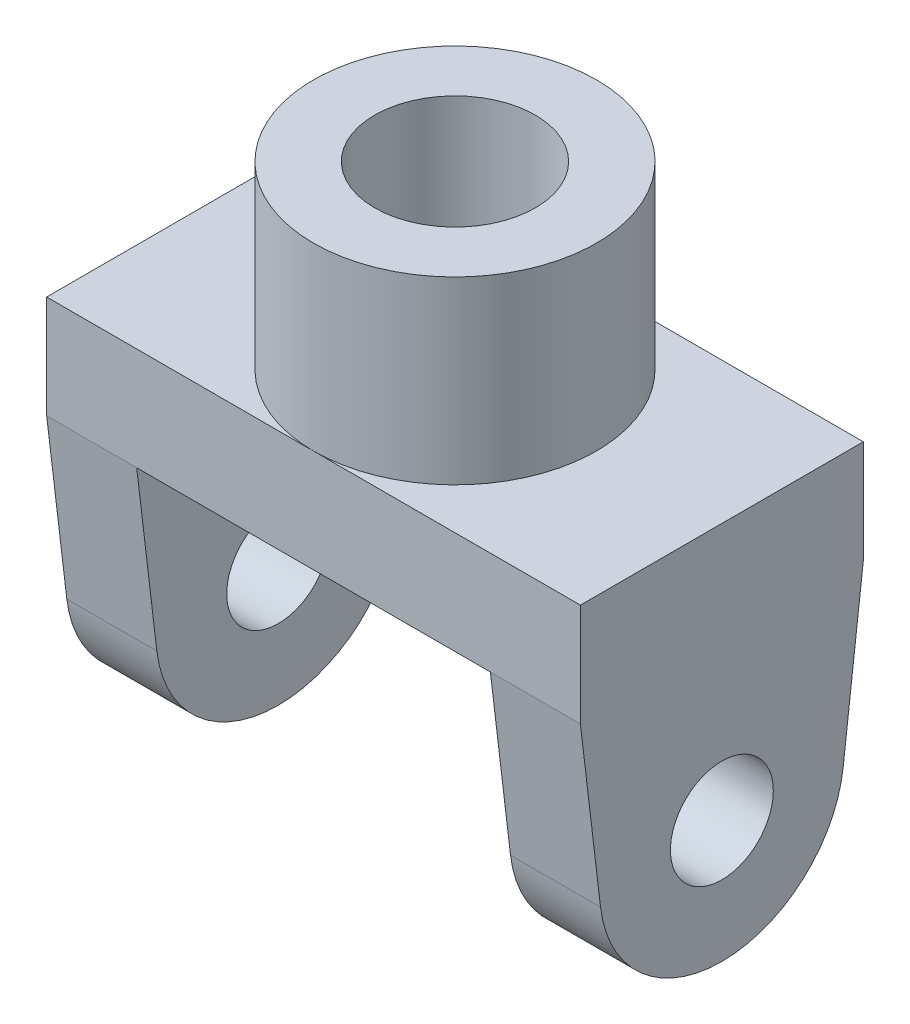
ISO-10303-21;
HEADER;
FILE_DESCRIPTION(('STEP AP214'),'2;1');
FILE_NAME('part.step','',(''),(''),'','','');
FILE_SCHEMA(('AUTOMOTIVE_DESIGN { 1 0 10303 214 1 1 1 1 }'));
ENDSEC;
DATA;
#1=APPLICATION_CONTEXT('core data for automotive mechanical design processes');
#2=APPLICATION_PROTOCOL_DEFINITION('international standard','automotive_design',2000,#1);
#3=PRODUCT_CONTEXT('',#1,'mechanical');
#4=PRODUCT('Part','Part','',(#3));
#5=PRODUCT_RELATED_PRODUCT_CATEGORY('part','',(#4));
#6=PRODUCT_DEFINITION_FORMATION('','',#4);
#7=PRODUCT_DEFINITION_CONTEXT('part definition',#1,'design');
#8=PRODUCT_DEFINITION('design','',#6,#7);
#9=PRODUCT_DEFINITION_SHAPE('','',#8);
#10=(LENGTH_UNIT() NAMED_UNIT(*) SI_UNIT(.MILLI.,.METRE.));
#11=(NAMED_UNIT(*) PLANE_ANGLE_UNIT() SI_UNIT($,.RADIAN.));
#12=(NAMED_UNIT(*) SI_UNIT($,.STERADIAN.) SOLID_ANGLE_UNIT());
#13=UNCERTAINTY_MEASURE_WITH_UNIT(LENGTH_MEASURE(1.E-05),#10,'distance_accuracy_value','');
#14=(GEOMETRIC_REPRESENTATION_CONTEXT(3) GLOBAL_UNCERTAINTY_ASSIGNED_CONTEXT((#13)) GLOBAL_UNIT_ASSIGNED_CONTEXT((#10,
#11,#12)) REPRESENTATION_CONTEXT('',''));
#15=CARTESIAN_POINT('',(0.,0.,0.));
#16=DIRECTION('',(0.,0.,1.));
#17=DIRECTION('',(1.,0.,0.));
#18=AXIS2_PLACEMENT_3D('',#15,#16,#17);
#19=CARTESIAN_POINT('',(0.,0.,0.));
#20=DIRECTION('',(0.,1.,0.));
#21=DIRECTION('',(0.,0.,1.));
#22=AXIS2_PLACEMENT_3D('',#19,#20,#21);
#23=PLANE('',#22);
#24=DIRECTION('',(0.,0.,-1.));
#25=VECTOR('',#24,1.);
#26=CARTESIAN_POINT('',(-55.,0.,0.));
#27=LINE('',#26,#25);
#28=CARTESIAN_POINT('',(-55.,0.,44.));
#29=VERTEX_POINT('',#28);
#30=CARTESIAN_POINT('',(-55.,0.,-44.));
#31=VERTEX_POINT('',#30);
#32=EDGE_CURVE('E125',#29,#31,#27,.T.);
#33=ORIENTED_EDGE('',*,*,#32,.T.);
#34=DIRECTION('',(-1.,0.,0.));
#35=VECTOR('',#34,1.);
#36=CARTESIAN_POINT('',(-83.,0.,-44.));
#37=LINE('',#36,#35);
#38=CARTESIAN_POINT('',(55.,0.,-44.));
#39=VERTEX_POINT('',#38);
#40=EDGE_CURVE('E144',#39,#31,#37,.T.);
#41=ORIENTED_EDGE('',*,*,#40,.F.);
#42=DIRECTION('',(0.,0.,-1.));
#43=VECTOR('',#42,1.);
#44=CARTESIAN_POINT('',(55.,0.,0.));
#45=LINE('',#44,#43);
#46=CARTESIAN_POINT('',(54.9999999999999,0.,44.));
#47=VERTEX_POINT('',#46);
#48=EDGE_CURVE('E205',#47,#39,#45,.T.);
#49=ORIENTED_EDGE('',*,*,#48,.F.);
#50=DIRECTION('',(1.,0.,0.));
#51=VECTOR('',#50,1.);
#52=CARTESIAN_POINT('',(-83.,0.,44.));
#53=LINE('',#52,#51);
#54=EDGE_CURVE('E61',#29,#47,#53,.T.);
#55=ORIENTED_EDGE('',*,*,#54,.F.);
#56=EDGE_LOOP('',(#33,#41,#49,#55));
#57=FACE_BOUND('',#56,.T.);
#58=ADVANCED_FACE('F36',(#57),#23,.F.);
#59=CARTESIAN_POINT('',(0.,32.,0.));
#60=DIRECTION('',(0.,1.,0.));
#61=DIRECTION('',(0.,0.,1.));
#62=AXIS2_PLACEMENT_3D('',#59,#60,#61);
#63=PLANE('',#62);
#64=CARTESIAN_POINT('',(0.,32.,0.));
#65=DIRECTION('',(0.,1.,0.));
#66=DIRECTION('',(0.,0.,1.));
#67=AXIS2_PLACEMENT_3D('',#64,#65,#66);
#68=CIRCLE('',#67,44.);
#69=CARTESIAN_POINT('',(0.,32.,44.));
#70=VERTEX_POINT('',#69);
#71=CARTESIAN_POINT('',(0.,32.,-44.));
#72=VERTEX_POINT('',#71);
#73=EDGE_CURVE('E46',#70,#72,#68,.T.);
#74=ORIENTED_EDGE('',*,*,#73,.F.);
#75=DIRECTION('',(1.,0.,0.));
#76=VECTOR('',#75,1.);
#77=CARTESIAN_POINT('',(-83.,32.,44.));
#78=LINE('',#77,#76);
#79=CARTESIAN_POINT('',(83.,32.,44.));
#80=VERTEX_POINT('',#79);
#81=EDGE_CURVE('E215',#70,#80,#78,.T.);
#82=ORIENTED_EDGE('',*,*,#81,.T.);
#83=DIRECTION('',(0.,0.,-1.));
#84=VECTOR('',#83,1.);
#85=CARTESIAN_POINT('',(83.,32.,-44.));
#86=LINE('',#85,#84);
#87=CARTESIAN_POINT('',(83.,32.,-44.));
#88=VERTEX_POINT('',#87);
#89=EDGE_CURVE('E160',#80,#88,#86,.T.);
#90=ORIENTED_EDGE('',*,*,#89,.T.);
#91=DIRECTION('',(-1.,0.,0.));
#92=VECTOR('',#91,1.);
#93=CARTESIAN_POINT('',(-83.,32.,-44.));
#94=LINE('',#93,#92);
#95=EDGE_CURVE('E172',#88,#72,#94,.T.);
#96=ORIENTED_EDGE('',*,*,#95,.T.);
#97=EDGE_LOOP('',(#74,#82,#90,#96));
#98=FACE_BOUND('',#97,.T.);
#99=ADVANCED_FACE('F225',(#98),#63,.T.);
#100=CARTESIAN_POINT('',(83.,32.,-44.));
#101=DIRECTION('',(-1.,0.,0.));
#102=DIRECTION('',(0.,0.,1.));
#103=AXIS2_PLACEMENT_3D('',#100,#101,#102);
#104=PLANE('',#103);
#105=DIRECTION('',(0.,-1.,0.));
#106=VECTOR('',#105,1.);
#107=CARTESIAN_POINT('',(83.,32.,44.));
#108=LINE('',#107,#106);
#109=CARTESIAN_POINT('',(83.,0.,44.));
#110=VERTEX_POINT('',#109);
#111=EDGE_CURVE('E161',#80,#110,#108,.T.);
#112=ORIENTED_EDGE('',*,*,#111,.T.);
#113=DIRECTION('',(0.,0.992949618101236,0.118537149926132));
#114=VECTOR('',#113,1.);
#115=CARTESIAN_POINT('',(83.,-5.17886238099833,43.3817535398451));
#116=LINE('',#115,#114);
#117=CARTESIAN_POINT('',(83.,-52.5044116971931,37.7320854878469));
#118=VERTEX_POINT('',#117);
#119=EDGE_CURVE('E194',#118,#110,#116,.T.);
#120=ORIENTED_EDGE('',*,*,#119,.F.);
#121=CARTESIAN_POINT('',(83.,-48.,0.));
#122=DIRECTION('',(1.,0.,0.));
#123=DIRECTION('',(0.,0.,-1.));
#124=AXIS2_PLACEMENT_3D('',#121,#122,#123);
#125=CIRCLE('',#124,38.);
#126=CARTESIAN_POINT('',(83.,-52.5044116971931,-37.732085487847));
#127=VERTEX_POINT('',#126);
#128=EDGE_CURVE('E188',#118,#127,#125,.T.);
#129=ORIENTED_EDGE('',*,*,#128,.T.);
#130=DIRECTION('',(0.,0.992949618101236,-0.118537149926133));
#131=VECTOR('',#130,1.);
#132=CARTESIAN_POINT('',(83.,-5.17886238099835,-43.3817535398452));
#133=LINE('',#132,#131);
#134=CARTESIAN_POINT('',(83.,0.,-44.));
#135=VERTEX_POINT('',#134);
#136=EDGE_CURVE('E181',#127,#135,#133,.T.);
#137=ORIENTED_EDGE('',*,*,#136,.T.);
#138=DIRECTION('',(0.,-1.,0.));
#139=VECTOR('',#138,1.);
#140=CARTESIAN_POINT('',(83.,32.,-44.));
#141=LINE('',#140,#139);
#142=EDGE_CURVE('E40',#88,#135,#141,.T.);
#143=ORIENTED_EDGE('',*,*,#142,.F.);
#144=ORIENTED_EDGE('',*,*,#89,.F.);
#145=EDGE_LOOP('',(#112,#120,#129,#137,#143,#144));
#146=FACE_BOUND('',#145,.T.);
#147=CARTESIAN_POINT('',(83.,-48.,0.));
#148=DIRECTION('',(1.,0.,0.));
#149=DIRECTION('',(0.,0.,-1.));
#150=AXIS2_PLACEMENT_3D('',#147,#148,#149);
#151=CIRCLE('',#150,16.);
#152=CARTESIAN_POINT('',(83.,-48.,-16.));
#153=VERTEX_POINT('',#152);
#154=EDGE_CURVE('E440',#153,#153,#151,.T.);
#155=ORIENTED_EDGE('',*,*,#154,.F.);
#156=EDGE_LOOP('',(#155));
#157=FACE_BOUND('',#156,.T.);
#158=ADVANCED_FACE('F38',(#146,#157),#104,.F.);
#159=CARTESIAN_POINT('',(-83.,32.,-44.));
#160=DIRECTION('',(0.,0.,1.));
#161=DIRECTION('',(1.,0.,0.));
#162=AXIS2_PLACEMENT_3D('',#159,#160,#161);
#163=PLANE('',#162);
#164=EDGE_CURVE('E149',#135,#39,#37,.T.);
#165=ORIENTED_EDGE('',*,*,#164,.T.);
#166=ORIENTED_EDGE('',*,*,#40,.T.);
#167=DIRECTION('',(-1.,0.,0.));
#168=VECTOR('',#167,1.);
#169=CARTESIAN_POINT('',(-55.,0.,-44.));
#170=LINE('',#169,#168);
#171=CARTESIAN_POINT('',(-83.,0.,-44.));
#172=VERTEX_POINT('',#171);
#173=EDGE_CURVE('E133',#31,#172,#170,.T.);
#174=ORIENTED_EDGE('',*,*,#173,.T.);
#175=DIRECTION('',(0.,-1.,0.));
#176=VECTOR('',#175,1.);
#177=CARTESIAN_POINT('',(-83.,32.,-44.));
#178=LINE('',#177,#176);
#179=CARTESIAN_POINT('',(-83.,32.,-44.));
#180=VERTEX_POINT('',#179);
#181=EDGE_CURVE('E166',#180,#172,#178,.T.);
#182=ORIENTED_EDGE('',*,*,#181,.F.);
#183=EDGE_CURVE('E213',#72,#180,#94,.T.);
#184=ORIENTED_EDGE('',*,*,#183,.F.);
#185=ORIENTED_EDGE('',*,*,#95,.F.);
#186=ORIENTED_EDGE('',*,*,#142,.T.);
#187=EDGE_LOOP('',(#165,#166,#174,#182,#184,#185,#186));
#188=FACE_BOUND('',#187,.T.);
#189=ADVANCED_FACE('F147',(#188),#163,.F.);
#190=CARTESIAN_POINT('',(-83.,32.,-44.));
#191=DIRECTION('',(1.,0.,0.));
#192=DIRECTION('',(0.,0.,-1.));
#193=AXIS2_PLACEMENT_3D('',#190,#191,#192);
#194=PLANE('',#193);
#195=ORIENTED_EDGE('',*,*,#181,.T.);
#196=DIRECTION('',(0.,0.992949618101236,-0.118537149926133));
#197=VECTOR('',#196,1.);
#198=CARTESIAN_POINT('',(-83.,-5.17886238099835,-43.3817535398452));
#199=LINE('',#198,#197);
#200=CARTESIAN_POINT('',(-83.,-52.5044116971931,-37.732085487847));
#201=VERTEX_POINT('',#200);
#202=EDGE_CURVE('E135',#201,#172,#199,.T.);
#203=ORIENTED_EDGE('',*,*,#202,.F.);
#204=CARTESIAN_POINT('',(-83.,-48.,0.));
#205=DIRECTION('',(1.,0.,0.));
#206=DIRECTION('',(0.,0.,-1.));
#207=AXIS2_PLACEMENT_3D('',#204,#205,#206);
#208=CIRCLE('',#207,38.);
#209=CARTESIAN_POINT('',(-83.,-52.5044116971931,37.7320854878469));
#210=VERTEX_POINT('',#209);
#211=EDGE_CURVE('E424',#210,#201,#208,.T.);
#212=ORIENTED_EDGE('',*,*,#211,.F.);
#213=DIRECTION('',(0.,0.992949618101236,0.118537149926132));
#214=VECTOR('',#213,1.);
#215=CARTESIAN_POINT('',(-83.,-5.17886238099833,43.3817535398451));
#216=LINE('',#215,#214);
#217=CARTESIAN_POINT('',(-83.,0.,44.));
#218=VERTEX_POINT('',#217);
#219=EDGE_CURVE('E434',#210,#218,#216,.T.);
#220=ORIENTED_EDGE('',*,*,#219,.T.);
#221=DIRECTION('',(0.,-1.,0.));
#222=VECTOR('',#221,1.);
#223=CARTESIAN_POINT('',(-83.,32.,44.));
#224=LINE('',#223,#222);
#225=CARTESIAN_POINT('',(-83.,32.,44.));
#226=VERTEX_POINT('',#225);
#227=EDGE_CURVE('E164',#226,#218,#224,.T.);
#228=ORIENTED_EDGE('',*,*,#227,.F.);
#229=DIRECTION('',(0.,0.,1.));
#230=VECTOR('',#229,1.);
#231=CARTESIAN_POINT('',(-83.,32.,-44.));
#232=LINE('',#231,#230);
#233=EDGE_CURVE('E214',#180,#226,#232,.T.);
#234=ORIENTED_EDGE('',*,*,#233,.F.);
#235=EDGE_LOOP('',(#195,#203,#212,#220,#228,#234));
#236=FACE_BOUND('',#235,.T.);
#237=CARTESIAN_POINT('',(-83.,-48.,0.));
#238=DIRECTION('',(1.,0.,0.));
#239=DIRECTION('',(0.,0.,-1.));
#240=AXIS2_PLACEMENT_3D('',#237,#238,#239);
#241=CIRCLE('',#240,16.);
#242=CARTESIAN_POINT('',(-83.,-48.,-16.));
#243=VERTEX_POINT('',#242);
#244=EDGE_CURVE('E431',#243,#243,#241,.T.);
#245=ORIENTED_EDGE('',*,*,#244,.T.);
#246=EDGE_LOOP('',(#245));
#247=FACE_BOUND('',#246,.T.);
#248=ADVANCED_FACE('F252',(#236,#247),#194,.F.);
#249=CARTESIAN_POINT('',(-83.,32.,44.));
#250=DIRECTION('',(0.,0.,-1.));
#251=DIRECTION('',(-1.,0.,0.));
#252=AXIS2_PLACEMENT_3D('',#249,#250,#251);
#253=PLANE('',#252);
#254=EDGE_CURVE('E158',#218,#29,#53,.T.);
#255=ORIENTED_EDGE('',*,*,#254,.T.);
#256=ORIENTED_EDGE('',*,*,#54,.T.);
#257=DIRECTION('',(1.,0.,0.));
#258=VECTOR('',#257,1.);
#259=CARTESIAN_POINT('',(55.,0.,44.));
#260=LINE('',#259,#258);
#261=EDGE_CURVE('E198',#47,#110,#260,.T.);
#262=ORIENTED_EDGE('',*,*,#261,.T.);
#263=ORIENTED_EDGE('',*,*,#111,.F.);
#264=ORIENTED_EDGE('',*,*,#81,.F.);
#265=EDGE_CURVE('E156',#226,#70,#78,.T.);
#266=ORIENTED_EDGE('',*,*,#265,.F.);
#267=ORIENTED_EDGE('',*,*,#227,.T.);
#268=EDGE_LOOP('',(#255,#256,#262,#263,#264,#266,#267));
#269=FACE_BOUND('',#268,.T.);
#270=ADVANCED_FACE('F224',(#269),#253,.F.);
#271=EDGE_CURVE('E11',#72,#70,#68,.T.);
#272=ORIENTED_EDGE('',*,*,#271,.F.);
#273=ORIENTED_EDGE('',*,*,#183,.T.);
#274=ORIENTED_EDGE('',*,*,#233,.T.);
#275=ORIENTED_EDGE('',*,*,#265,.T.);
#276=EDGE_LOOP('',(#272,#273,#274,#275));
#277=FACE_BOUND('',#276,.T.);
#278=ADVANCED_FACE('F223',(#277),#63,.T.);
#279=CARTESIAN_POINT('',(0.,88.,0.));
#280=DIRECTION('',(0.,1.,0.));
#281=DIRECTION('',(0.,0.,1.));
#282=AXIS2_PLACEMENT_3D('',#279,#280,#281);
#283=PLANE('',#282);
#284=CARTESIAN_POINT('',(0.,88.,0.));
#285=DIRECTION('',(0.,1.,0.));
#286=DIRECTION('',(0.,0.,1.));
#287=AXIS2_PLACEMENT_3D('',#284,#285,#286);
#288=CIRCLE('',#287,44.);
#289=CARTESIAN_POINT('',(0.,88.,44.));
#290=VERTEX_POINT('',#289);
#291=EDGE_CURVE('E150',#290,#290,#288,.T.);
#292=ORIENTED_EDGE('',*,*,#291,.T.);
#293=EDGE_LOOP('',(#292));
#294=FACE_BOUND('',#293,.T.);
#295=CARTESIAN_POINT('',(0.,88.,0.));
#296=DIRECTION('',(0.,1.,0.));
#297=DIRECTION('',(0.,0.,1.));
#298=AXIS2_PLACEMENT_3D('',#295,#296,#297);
#299=CIRCLE('',#298,25.);
#300=CARTESIAN_POINT('',(0.,88.,25.));
#301=VERTEX_POINT('',#300);
#302=EDGE_CURVE('E206',#301,#301,#299,.T.);
#303=ORIENTED_EDGE('',*,*,#302,.F.);
#304=EDGE_LOOP('',(#303));
#305=FACE_BOUND('',#304,.T.);
#306=ADVANCED_FACE('F230',(#294,#305),#283,.T.);
#307=CARTESIAN_POINT('',(0.,88.,0.));
#308=DIRECTION('',(0.,-1.,0.));
#309=DIRECTION('',(0.,0.,-1.));
#310=AXIS2_PLACEMENT_3D('',#307,#308,#309);
#311=CYLINDRICAL_SURFACE('',#310,44.);
#312=ORIENTED_EDGE('',*,*,#291,.F.);
#313=EDGE_LOOP('',(#312));
#314=FACE_BOUND('',#313,.T.);
#315=ORIENTED_EDGE('',*,*,#73,.T.);
#316=ORIENTED_EDGE('',*,*,#271,.T.);
#317=EDGE_LOOP('',(#315,#316));
#318=FACE_BOUND('',#317,.T.);
#319=ADVANCED_FACE('F227',(#314,#318),#311,.T.);
#320=CARTESIAN_POINT('',(0.,88.,0.));
#321=DIRECTION('',(0.,-1.,0.));
#322=DIRECTION('',(0.,0.,-1.));
#323=AXIS2_PLACEMENT_3D('',#320,#321,#322);
#324=CYLINDRICAL_SURFACE('',#323,25.);
#325=ORIENTED_EDGE('',*,*,#302,.T.);
#326=EDGE_LOOP('',(#325));
#327=FACE_BOUND('',#326,.T.);
#328=CARTESIAN_POINT('',(0.,32.,0.));
#329=DIRECTION('',(0.,1.,0.));
#330=DIRECTION('',(0.,0.,1.));
#331=AXIS2_PLACEMENT_3D('',#328,#329,#330);
#332=CIRCLE('',#331,25.);
#333=CARTESIAN_POINT('',(0.,32.,25.));
#334=VERTEX_POINT('',#333);
#335=EDGE_CURVE('E200',#334,#334,#332,.T.);
#336=ORIENTED_EDGE('',*,*,#335,.F.);
#337=EDGE_LOOP('',(#336));
#338=FACE_BOUND('',#337,.T.);
#339=ADVANCED_FACE('F229',(#327,#338),#324,.F.);
#340=ORIENTED_EDGE('',*,*,#335,.T.);
#341=EDGE_LOOP('',(#340));
#342=FACE_BOUND('',#341,.T.);
#343=ADVANCED_FACE('F237',(#342),#63,.T.);
#344=CARTESIAN_POINT('',(55.,-5.17886238099833,43.3817535398451));
#345=DIRECTION('',(0.,0.118537149926132,-0.992949618101236));
#346=DIRECTION('',(0.,0.992949618101236,0.118537149926132));
#347=AXIS2_PLACEMENT_3D('',#344,#345,#346);
#348=PLANE('',#347);
#349=ORIENTED_EDGE('',*,*,#119,.T.);
#350=ORIENTED_EDGE('',*,*,#261,.F.);
#351=DIRECTION('',(0.,0.992949618101236,0.118537149926132));
#352=VECTOR('',#351,1.);
#353=CARTESIAN_POINT('',(55.,-5.17886238099833,43.3817535398451));
#354=LINE('',#353,#352);
#355=CARTESIAN_POINT('',(55.,-52.5044116971931,37.7320854878469));
#356=VERTEX_POINT('',#355);
#357=EDGE_CURVE('E192',#356,#47,#354,.T.);
#358=ORIENTED_EDGE('',*,*,#357,.F.);
#359=DIRECTION('',(1.,0.,0.));
#360=VECTOR('',#359,1.);
#361=CARTESIAN_POINT('',(55.,-52.5044116971931,37.7320854878469));
#362=LINE('',#361,#360);
#363=EDGE_CURVE('E203',#356,#118,#362,.T.);
#364=ORIENTED_EDGE('',*,*,#363,.T.);
#365=EDGE_LOOP('',(#349,#350,#358,#364));
#366=FACE_BOUND('',#365,.T.);
#367=ADVANCED_FACE('F297',(#366),#348,.F.);
#368=CARTESIAN_POINT('',(55.,-5.17886238099835,-43.3817535398452));
#369=DIRECTION('',(0.,-0.118537149926133,-0.992949618101236));
#370=DIRECTION('',(0.,0.992949618101236,-0.118537149926133));
#371=AXIS2_PLACEMENT_3D('',#368,#369,#370);
#372=PLANE('',#371);
#373=ORIENTED_EDGE('',*,*,#136,.F.);
#374=DIRECTION('',(1.,0.,0.));
#375=VECTOR('',#374,1.);
#376=CARTESIAN_POINT('',(55.,-52.5044116971931,-37.732085487847));
#377=LINE('',#376,#375);
#378=CARTESIAN_POINT('',(55.,-52.5044116971931,-37.732085487847));
#379=VERTEX_POINT('',#378);
#380=EDGE_CURVE('E201',#379,#127,#377,.T.);
#381=ORIENTED_EDGE('',*,*,#380,.F.);
#382=DIRECTION('',(0.,0.992949618101236,-0.118537149926133));
#383=VECTOR('',#382,1.);
#384=CARTESIAN_POINT('',(55.,-5.17886238099835,-43.3817535398452));
#385=LINE('',#384,#383);
#386=EDGE_CURVE('E184',#379,#39,#385,.T.);
#387=ORIENTED_EDGE('',*,*,#386,.T.);
#388=ORIENTED_EDGE('',*,*,#164,.F.);
#389=EDGE_LOOP('',(#373,#381,#387,#388));
#390=FACE_BOUND('',#389,.T.);
#391=ADVANCED_FACE('F180',(#390),#372,.T.);
#392=CARTESIAN_POINT('',(55.,-48.,0.));
#393=DIRECTION('',(1.,0.,0.));
#394=DIRECTION('',(0.,0.,-1.));
#395=AXIS2_PLACEMENT_3D('',#392,#393,#394);
#396=CYLINDRICAL_SURFACE('',#395,16.);
#397=CARTESIAN_POINT('',(55.,-48.,0.));
#398=DIRECTION('',(1.,0.,0.));
#399=DIRECTION('',(0.,0.,-1.));
#400=AXIS2_PLACEMENT_3D('',#397,#398,#399);
#401=CIRCLE('',#400,16.);
#402=CARTESIAN_POINT('',(55.,-48.,-16.));
#403=VERTEX_POINT('',#402);
#404=EDGE_CURVE('E189',#403,#403,#401,.T.);
#405=ORIENTED_EDGE('',*,*,#404,.F.);
#406=EDGE_LOOP('',(#405));
#407=FACE_BOUND('',#406,.T.);
#408=ORIENTED_EDGE('',*,*,#154,.T.);
#409=EDGE_LOOP('',(#408));
#410=FACE_BOUND('',#409,.T.);
#411=ADVANCED_FACE('F312',(#407,#410),#396,.F.);
#412=CARTESIAN_POINT('',(55.,-48.,0.));
#413=DIRECTION('',(1.,0.,0.));
#414=DIRECTION('',(0.,0.,-1.));
#415=AXIS2_PLACEMENT_3D('',#412,#413,#414);
#416=CYLINDRICAL_SURFACE('',#415,38.);
#417=ORIENTED_EDGE('',*,*,#128,.F.);
#418=ORIENTED_EDGE('',*,*,#363,.F.);
#419=CARTESIAN_POINT('',(55.,-48.,0.));
#420=DIRECTION('',(1.,0.,0.));
#421=DIRECTION('',(0.,0.,-1.));
#422=AXIS2_PLACEMENT_3D('',#419,#420,#421);
#423=CIRCLE('',#422,38.);
#424=EDGE_CURVE('E444',#356,#379,#423,.T.);
#425=ORIENTED_EDGE('',*,*,#424,.T.);
#426=ORIENTED_EDGE('',*,*,#380,.T.);
#427=EDGE_LOOP('',(#417,#418,#425,#426));
#428=FACE_BOUND('',#427,.T.);
#429=ADVANCED_FACE('F319',(#428),#416,.T.);
#430=CARTESIAN_POINT('',(55.,0.,0.));
#431=DIRECTION('',(1.,0.,0.));
#432=DIRECTION('',(0.,0.,-1.));
#433=AXIS2_PLACEMENT_3D('',#430,#431,#432);
#434=PLANE('',#433);
#435=ORIENTED_EDGE('',*,*,#404,.T.);
#436=EDGE_LOOP('',(#435));
#437=FACE_BOUND('',#436,.T.);
#438=ORIENTED_EDGE('',*,*,#357,.T.);
#439=ORIENTED_EDGE('',*,*,#48,.T.);
#440=ORIENTED_EDGE('',*,*,#386,.F.);
#441=ORIENTED_EDGE('',*,*,#424,.F.);
#442=EDGE_LOOP('',(#438,#439,#440,#441));
#443=FACE_BOUND('',#442,.T.);
#444=ADVANCED_FACE('F327',(#437,#443),#434,.F.);
#445=CARTESIAN_POINT('',(-55.,-5.17886238099833,43.3817535398451));
#446=DIRECTION('',(0.,-0.118537149926132,0.992949618101236));
#447=DIRECTION('',(0.,-0.992949618101236,-0.118537149926132));
#448=AXIS2_PLACEMENT_3D('',#445,#446,#447);
#449=PLANE('',#448);
#450=ORIENTED_EDGE('',*,*,#219,.F.);
#451=DIRECTION('',(-1.,0.,0.));
#452=VECTOR('',#451,1.);
#453=CARTESIAN_POINT('',(-55.,-52.5044116971931,37.7320854878469));
#454=LINE('',#453,#452);
#455=CARTESIAN_POINT('',(-55.,-52.5044116971931,37.7320854878469));
#456=VERTEX_POINT('',#455);
#457=EDGE_CURVE('E438',#456,#210,#454,.T.);
#458=ORIENTED_EDGE('',*,*,#457,.F.);
#459=DIRECTION('',(0.,0.992949618101236,0.118537149926132));
#460=VECTOR('',#459,1.);
#461=CARTESIAN_POINT('',(-55.,-5.17886238099833,43.3817535398451));
#462=LINE('',#461,#460);
#463=EDGE_CURVE('E53',#456,#29,#462,.T.);
#464=ORIENTED_EDGE('',*,*,#463,.T.);
#465=ORIENTED_EDGE('',*,*,#254,.F.);
#466=EDGE_LOOP('',(#450,#458,#464,#465));
#467=FACE_BOUND('',#466,.T.);
#468=ADVANCED_FACE('F335',(#467),#449,.T.);
#469=CARTESIAN_POINT('',(-55.,-48.,0.));
#470=DIRECTION('',(-1.,0.,0.));
#471=DIRECTION('',(0.,0.,1.));
#472=AXIS2_PLACEMENT_3D('',#469,#470,#471);
#473=CYLINDRICAL_SURFACE('',#472,38.);
#474=ORIENTED_EDGE('',*,*,#211,.T.);
#475=DIRECTION('',(-1.,0.,0.));
#476=VECTOR('',#475,1.);
#477=CARTESIAN_POINT('',(-55.,-52.5044116971931,-37.732085487847));
#478=LINE('',#477,#476);
#479=CARTESIAN_POINT('',(-55.,-52.5044116971931,-37.732085487847));
#480=VERTEX_POINT('',#479);
#481=EDGE_CURVE('E140',#480,#201,#478,.T.);
#482=ORIENTED_EDGE('',*,*,#481,.F.);
#483=CARTESIAN_POINT('',(-55.,-48.,0.));
#484=DIRECTION('',(1.,0.,0.));
#485=DIRECTION('',(0.,0.,-1.));
#486=AXIS2_PLACEMENT_3D('',#483,#484,#485);
#487=CIRCLE('',#486,38.);
#488=EDGE_CURVE('E127',#456,#480,#487,.T.);
#489=ORIENTED_EDGE('',*,*,#488,.F.);
#490=ORIENTED_EDGE('',*,*,#457,.T.);
#491=EDGE_LOOP('',(#474,#482,#489,#490));
#492=FACE_BOUND('',#491,.T.);
#493=ADVANCED_FACE('F343',(#492),#473,.T.);
#494=CARTESIAN_POINT('',(-55.,-5.17886238099835,-43.3817535398452));
#495=DIRECTION('',(0.,0.118537149926133,0.992949618101236));
#496=DIRECTION('',(0.,-0.992949618101236,0.118537149926133));
#497=AXIS2_PLACEMENT_3D('',#494,#495,#496);
#498=PLANE('',#497);
#499=ORIENTED_EDGE('',*,*,#202,.T.);
#500=ORIENTED_EDGE('',*,*,#173,.F.);
#501=DIRECTION('',(0.,0.992949618101236,-0.118537149926133));
#502=VECTOR('',#501,1.);
#503=CARTESIAN_POINT('',(-55.,-5.17886238099835,-43.3817535398452));
#504=LINE('',#503,#502);
#505=EDGE_CURVE('E121',#480,#31,#504,.T.);
#506=ORIENTED_EDGE('',*,*,#505,.F.);
#507=ORIENTED_EDGE('',*,*,#481,.T.);
#508=EDGE_LOOP('',(#499,#500,#506,#507));
#509=FACE_BOUND('',#508,.T.);
#510=ADVANCED_FACE('F134',(#509),#498,.F.);
#511=CARTESIAN_POINT('',(-55.,-48.,0.));
#512=DIRECTION('',(-1.,0.,0.));
#513=DIRECTION('',(0.,0.,1.));
#514=AXIS2_PLACEMENT_3D('',#511,#512,#513);
#515=CYLINDRICAL_SURFACE('',#514,16.);
#516=CARTESIAN_POINT('',(-55.,-48.,0.));
#517=DIRECTION('',(1.,0.,0.));
#518=DIRECTION('',(0.,0.,-1.));
#519=AXIS2_PLACEMENT_3D('',#516,#517,#518);
#520=CIRCLE('',#519,16.);
#521=CARTESIAN_POINT('',(-55.,-48.,-16.));
#522=VERTEX_POINT('',#521);
#523=EDGE_CURVE('E423',#522,#522,#520,.T.);
#524=ORIENTED_EDGE('',*,*,#523,.T.);
#525=EDGE_LOOP('',(#524));
#526=FACE_BOUND('',#525,.T.);
#527=ORIENTED_EDGE('',*,*,#244,.F.);
#528=EDGE_LOOP('',(#527));
#529=FACE_BOUND('',#528,.T.);
#530=ADVANCED_FACE('F358',(#526,#529),#515,.F.);
#531=CARTESIAN_POINT('',(-55.,0.,0.));
#532=DIRECTION('',(-1.,0.,0.));
#533=DIRECTION('',(0.,0.,-1.));
#534=AXIS2_PLACEMENT_3D('',#531,#532,#533);
#535=PLANE('',#534);
#536=ORIENTED_EDGE('',*,*,#523,.F.);
#537=EDGE_LOOP('',(#536));
#538=FACE_BOUND('',#537,.T.);
#539=ORIENTED_EDGE('',*,*,#463,.F.);
#540=ORIENTED_EDGE('',*,*,#488,.T.);
#541=ORIENTED_EDGE('',*,*,#505,.T.);
#542=ORIENTED_EDGE('',*,*,#32,.F.);
#543=EDGE_LOOP('',(#539,#540,#541,#542));
#544=FACE_BOUND('',#543,.T.);
#545=ADVANCED_FACE('F123',(#538,#544),#535,.F.);
#546=CLOSED_SHELL('',(#58,#99,#158,#189,#248,#270,#278,#306,#319,#339,#343,#367,#391,#411,#429,
#444,#468,#493,#510,#530,#545));
#547=MANIFOLD_SOLID_BREP('B2',#546);
#548=ADVANCED_BREP_SHAPE_REPRESENTATION('',(#18,#547),#14);
#549=SHAPE_DEFINITION_REPRESENTATION(#9,#548);
ENDSEC;
END-ISO-10303-21;
